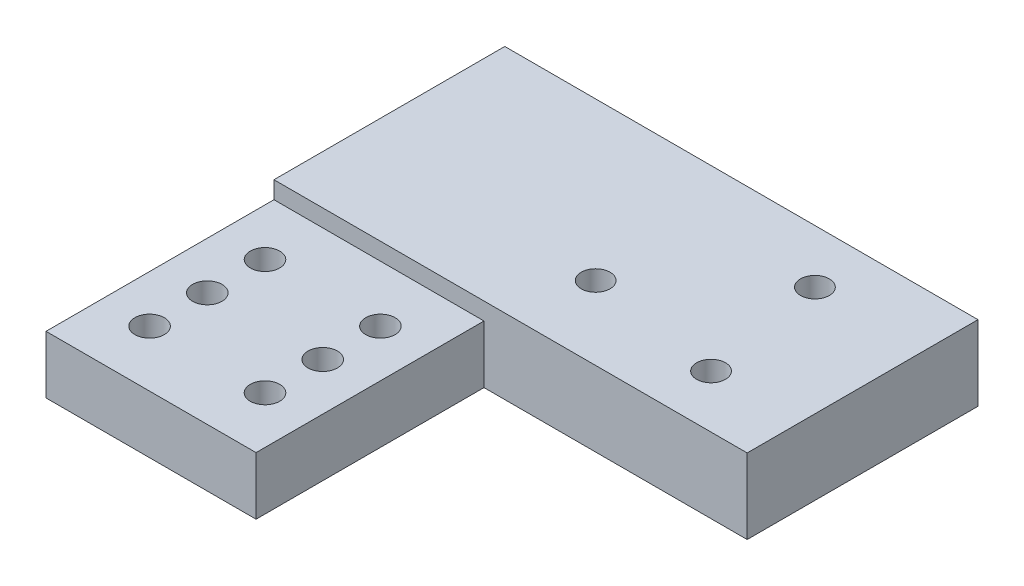
ISO-10303-21;
HEADER;
FILE_DESCRIPTION(('STEP AP214'),'2;1');
FILE_NAME('part.step','',(''),(''),'','','');
FILE_SCHEMA(('AUTOMOTIVE_DESIGN { 1 0 10303 214 1 1 1 1 }'));
ENDSEC;
DATA;
#1=APPLICATION_CONTEXT('core data for automotive mechanical design processes');
#2=APPLICATION_PROTOCOL_DEFINITION('international standard','automotive_design',2000,#1);
#3=PRODUCT_CONTEXT('',#1,'mechanical');
#4=PRODUCT('Part','Part','',(#3));
#5=PRODUCT_RELATED_PRODUCT_CATEGORY('part','',(#4));
#6=PRODUCT_DEFINITION_FORMATION('','',#4);
#7=PRODUCT_DEFINITION_CONTEXT('part definition',#1,'design');
#8=PRODUCT_DEFINITION('design','',#6,#7);
#9=PRODUCT_DEFINITION_SHAPE('','',#8);
#10=(LENGTH_UNIT() NAMED_UNIT(*) SI_UNIT(.MILLI.,.METRE.));
#11=(NAMED_UNIT(*) PLANE_ANGLE_UNIT() SI_UNIT($,.RADIAN.));
#12=(NAMED_UNIT(*) SI_UNIT($,.STERADIAN.) SOLID_ANGLE_UNIT());
#13=UNCERTAINTY_MEASURE_WITH_UNIT(LENGTH_MEASURE(1.E-05),#10,'distance_accuracy_value','');
#14=(GEOMETRIC_REPRESENTATION_CONTEXT(3) GLOBAL_UNCERTAINTY_ASSIGNED_CONTEXT((#13)) GLOBAL_UNIT_ASSIGNED_CONTEXT((#10,
#11,#12)) REPRESENTATION_CONTEXT('',''));
#15=CARTESIAN_POINT('',(0.,0.,0.));
#16=DIRECTION('',(0.,0.,1.));
#17=DIRECTION('',(1.,0.,0.));
#18=AXIS2_PLACEMENT_3D('',#15,#16,#17);
#19=CARTESIAN_POINT('',(0.,10.,0.));
#20=DIRECTION('',(0.,-1.,0.));
#21=DIRECTION('',(0.,0.,-1.));
#22=AXIS2_PLACEMENT_3D('',#19,#20,#21);
#23=PLANE('',#22);
#24=DIRECTION('',(0.,0.,1.));
#25=VECTOR('',#24,1.);
#26=CARTESIAN_POINT('',(0.,10.,0.));
#27=LINE('',#26,#25);
#28=CARTESIAN_POINT('',(0.,10.,-39.5));
#29=VERTEX_POINT('',#28);
#30=CARTESIAN_POINT('',(0.,10.,0.));
#31=VERTEX_POINT('',#30);
#32=EDGE_CURVE('E89',#29,#31,#27,.T.);
#33=ORIENTED_EDGE('',*,*,#32,.T.);
#34=DIRECTION('',(1.,0.,0.));
#35=VECTOR('',#34,1.);
#36=CARTESIAN_POINT('',(0.,10.,0.));
#37=LINE('',#36,#35);
#38=CARTESIAN_POINT('',(36.4,10.,0.));
#39=VERTEX_POINT('',#38);
#40=EDGE_CURVE('E84',#31,#39,#37,.T.);
#41=ORIENTED_EDGE('',*,*,#40,.T.);
#42=DIRECTION('',(0.,0.,-1.));
#43=VECTOR('',#42,1.);
#44=CARTESIAN_POINT('',(36.4,10.,0.));
#45=LINE('',#44,#43);
#46=CARTESIAN_POINT('',(36.4,10.,-39.5));
#47=VERTEX_POINT('',#46);
#48=EDGE_CURVE('E88',#39,#47,#45,.T.);
#49=ORIENTED_EDGE('',*,*,#48,.T.);
#50=DIRECTION('',(-1.,0.,0.));
#51=VECTOR('',#50,1.);
#52=CARTESIAN_POINT('',(0.,10.,-39.5));
#53=LINE('',#52,#51);
#54=EDGE_CURVE('E55',#47,#29,#53,.T.);
#55=ORIENTED_EDGE('',*,*,#54,.T.);
#56=EDGE_LOOP('',(#33,#41,#49,#55));
#57=FACE_BOUND('',#56,.T.);
#58=CARTESIAN_POINT('',(8.2,10.,-29.75));
#59=DIRECTION('',(0.,1.,0.));
#60=DIRECTION('',(0.,0.,1.));
#61=AXIS2_PLACEMENT_3D('',#58,#59,#60);
#62=CIRCLE('',#61,2.55);
#63=CARTESIAN_POINT('',(8.2,10.,-27.2));
#64=VERTEX_POINT('',#63);
#65=EDGE_CURVE('E103',#64,#64,#62,.T.);
#66=ORIENTED_EDGE('',*,*,#65,.F.);
#67=EDGE_LOOP('',(#66));
#68=FACE_BOUND('',#67,.T.);
#69=CARTESIAN_POINT('',(28.2,10.,-29.75));
#70=DIRECTION('',(0.,1.,0.));
#71=DIRECTION('',(0.,0.,1.));
#72=AXIS2_PLACEMENT_3D('',#69,#70,#71);
#73=CIRCLE('',#72,2.55);
#74=CARTESIAN_POINT('',(28.2,10.,-27.2));
#75=VERTEX_POINT('',#74);
#76=EDGE_CURVE('E178',#75,#75,#73,.T.);
#77=ORIENTED_EDGE('',*,*,#76,.F.);
#78=EDGE_LOOP('',(#77));
#79=FACE_BOUND('',#78,.T.);
#80=CARTESIAN_POINT('',(28.2000000000001,10.,-19.75));
#81=DIRECTION('',(0.,1.,0.));
#82=DIRECTION('',(0.,0.,1.));
#83=AXIS2_PLACEMENT_3D('',#80,#81,#82);
#84=CIRCLE('',#83,2.55);
#85=CARTESIAN_POINT('',(28.2000000000001,10.,-17.2));
#86=VERTEX_POINT('',#85);
#87=EDGE_CURVE('E172',#86,#86,#84,.T.);
#88=ORIENTED_EDGE('',*,*,#87,.F.);
#89=EDGE_LOOP('',(#88));
#90=FACE_BOUND('',#89,.T.);
#91=CARTESIAN_POINT('',(28.2000000000002,10.,-9.75));
#92=DIRECTION('',(0.,1.,0.));
#93=DIRECTION('',(0.,0.,1.));
#94=AXIS2_PLACEMENT_3D('',#91,#92,#93);
#95=CIRCLE('',#94,2.55);
#96=CARTESIAN_POINT('',(28.2000000000002,10.,-7.2));
#97=VERTEX_POINT('',#96);
#98=EDGE_CURVE('E166',#97,#97,#95,.T.);
#99=ORIENTED_EDGE('',*,*,#98,.F.);
#100=EDGE_LOOP('',(#99));
#101=FACE_BOUND('',#100,.T.);
#102=CARTESIAN_POINT('',(8.2000000000001,10.,-19.75));
#103=DIRECTION('',(0.,1.,0.));
#104=DIRECTION('',(0.,0.,1.));
#105=AXIS2_PLACEMENT_3D('',#102,#103,#104);
#106=CIRCLE('',#105,2.55);
#107=CARTESIAN_POINT('',(8.2000000000001,10.,-17.2));
#108=VERTEX_POINT('',#107);
#109=EDGE_CURVE('E160',#108,#108,#106,.T.);
#110=ORIENTED_EDGE('',*,*,#109,.F.);
#111=EDGE_LOOP('',(#110));
#112=FACE_BOUND('',#111,.T.);
#113=CARTESIAN_POINT('',(8.20000000000021,10.,-9.75));
#114=DIRECTION('',(0.,1.,0.));
#115=DIRECTION('',(0.,0.,1.));
#116=AXIS2_PLACEMENT_3D('',#113,#114,#115);
#117=CIRCLE('',#116,2.55);
#118=CARTESIAN_POINT('',(8.20000000000021,10.,-7.2));
#119=VERTEX_POINT('',#118);
#120=EDGE_CURVE('E154',#119,#119,#117,.T.);
#121=ORIENTED_EDGE('',*,*,#120,.F.);
#122=EDGE_LOOP('',(#121));
#123=FACE_BOUND('',#122,.T.);
#124=ADVANCED_FACE('F38',(#57,#68,#79,#90,#101,#112,#123),#23,.F.);
#125=CARTESIAN_POINT('',(0.,0.,0.));
#126=DIRECTION('',(0.,-1.,0.));
#127=DIRECTION('',(0.,0.,-1.));
#128=AXIS2_PLACEMENT_3D('',#125,#126,#127);
#129=PLANE('',#128);
#130=CARTESIAN_POINT('',(42.9961003087144,0.,-52.2456670076269));
#131=DIRECTION('',(0.,1.,0.));
#132=DIRECTION('',(0.,0.,1.));
#133=AXIS2_PLACEMENT_3D('',#130,#131,#132);
#134=CIRCLE('',#133,2.5);
#135=CARTESIAN_POINT('',(42.9961003087144,0.,-49.7456670076269));
#136=VERTEX_POINT('',#135);
#137=EDGE_CURVE('E440',#136,#136,#134,.T.);
#138=ORIENTED_EDGE('',*,*,#137,.T.);
#139=EDGE_LOOP('',(#138));
#140=FACE_BOUND('',#139,.T.);
#141=CARTESIAN_POINT('',(62.9961003087144,0.,-70.2456670076269));
#142=DIRECTION('',(0.,1.,0.));
#143=DIRECTION('',(0.,0.,1.));
#144=AXIS2_PLACEMENT_3D('',#141,#142,#143);
#145=CIRCLE('',#144,2.49999999999999);
#146=CARTESIAN_POINT('',(62.9961003087144,0.,-67.7456670076269));
#147=VERTEX_POINT('',#146);
#148=EDGE_CURVE('E450',#147,#147,#145,.T.);
#149=ORIENTED_EDGE('',*,*,#148,.T.);
#150=EDGE_LOOP('',(#149));
#151=FACE_BOUND('',#150,.T.);
#152=CARTESIAN_POINT('',(66.5818867463413,0.,-48.65988057));
#153=DIRECTION('',(0.,1.,0.));
#154=DIRECTION('',(0.,0.,1.));
#155=AXIS2_PLACEMENT_3D('',#152,#153,#154);
#156=CIRCLE('',#155,2.49999999999999);
#157=CARTESIAN_POINT('',(66.5818867463413,0.,-46.15988057));
#158=VERTEX_POINT('',#157);
#159=EDGE_CURVE('E121',#158,#158,#156,.T.);
#160=ORIENTED_EDGE('',*,*,#159,.T.);
#161=EDGE_LOOP('',(#160));
#162=FACE_BOUND('',#161,.T.);
#163=CARTESIAN_POINT('',(8.2000000000001,0.,-19.75));
#164=DIRECTION('',(0.,1.,0.));
#165=DIRECTION('',(0.,0.,1.));
#166=AXIS2_PLACEMENT_3D('',#163,#164,#165);
#167=CIRCLE('',#166,2.55);
#168=CARTESIAN_POINT('',(8.2000000000001,0.,-17.2));
#169=VERTEX_POINT('',#168);
#170=EDGE_CURVE('E157',#169,#169,#167,.T.);
#171=ORIENTED_EDGE('',*,*,#170,.T.);
#172=EDGE_LOOP('',(#171));
#173=FACE_BOUND('',#172,.T.);
#174=CARTESIAN_POINT('',(28.2000000000001,0.,-19.75));
#175=DIRECTION('',(0.,1.,0.));
#176=DIRECTION('',(0.,0.,1.));
#177=AXIS2_PLACEMENT_3D('',#174,#175,#176);
#178=CIRCLE('',#177,2.55);
#179=CARTESIAN_POINT('',(28.2000000000001,0.,-17.2));
#180=VERTEX_POINT('',#179);
#181=EDGE_CURVE('E169',#180,#180,#178,.T.);
#182=ORIENTED_EDGE('',*,*,#181,.T.);
#183=EDGE_LOOP('',(#182));
#184=FACE_BOUND('',#183,.T.);
#185=CARTESIAN_POINT('',(8.2,0.,-29.75));
#186=DIRECTION('',(0.,1.,0.));
#187=DIRECTION('',(0.,0.,1.));
#188=AXIS2_PLACEMENT_3D('',#185,#186,#187);
#189=CIRCLE('',#188,2.55);
#190=CARTESIAN_POINT('',(8.2,0.,-27.2));
#191=VERTEX_POINT('',#190);
#192=EDGE_CURVE('E181',#191,#191,#189,.T.);
#193=ORIENTED_EDGE('',*,*,#192,.T.);
#194=EDGE_LOOP('',(#193));
#195=FACE_BOUND('',#194,.T.);
#196=DIRECTION('',(0.,0.,1.));
#197=VECTOR('',#196,1.);
#198=CARTESIAN_POINT('',(0.,0.,0.));
#199=LINE('',#198,#197);
#200=CARTESIAN_POINT('',(0.,0.,-79.5));
#201=VERTEX_POINT('',#200);
#202=CARTESIAN_POINT('',(0.,0.,0.));
#203=VERTEX_POINT('',#202);
#204=EDGE_CURVE('E100',#201,#203,#199,.T.);
#205=ORIENTED_EDGE('',*,*,#204,.F.);
#206=DIRECTION('',(-1.,0.,0.));
#207=VECTOR('',#206,1.);
#208=CARTESIAN_POINT('',(0.,0.,-79.5));
#209=LINE('',#208,#207);
#210=CARTESIAN_POINT('',(82.,0.,-79.5));
#211=VERTEX_POINT('',#210);
#212=EDGE_CURVE('E123',#211,#201,#209,.T.);
#213=ORIENTED_EDGE('',*,*,#212,.F.);
#214=DIRECTION('',(0.,0.,-1.));
#215=VECTOR('',#214,1.);
#216=CARTESIAN_POINT('',(82.,0.,-39.5));
#217=LINE('',#216,#215);
#218=CARTESIAN_POINT('',(82.,0.,-39.5));
#219=VERTEX_POINT('',#218);
#220=EDGE_CURVE('E120',#219,#211,#217,.T.);
#221=ORIENTED_EDGE('',*,*,#220,.F.);
#222=DIRECTION('',(1.,0.,0.));
#223=VECTOR('',#222,1.);
#224=CARTESIAN_POINT('',(0.,0.,-39.5));
#225=LINE('',#224,#223);
#226=CARTESIAN_POINT('',(36.4,0.,-39.5));
#227=VERTEX_POINT('',#226);
#228=EDGE_CURVE('E112',#227,#219,#225,.T.);
#229=ORIENTED_EDGE('',*,*,#228,.F.);
#230=DIRECTION('',(0.,0.,-1.));
#231=VECTOR('',#230,1.);
#232=CARTESIAN_POINT('',(36.4,0.,0.));
#233=LINE('',#232,#231);
#234=CARTESIAN_POINT('',(36.4,0.,0.));
#235=VERTEX_POINT('',#234);
#236=EDGE_CURVE('E75',#235,#227,#233,.T.);
#237=ORIENTED_EDGE('',*,*,#236,.F.);
#238=DIRECTION('',(1.,0.,0.));
#239=VECTOR('',#238,1.);
#240=CARTESIAN_POINT('',(0.,0.,0.));
#241=LINE('',#240,#239);
#242=EDGE_CURVE('E67',#203,#235,#241,.T.);
#243=ORIENTED_EDGE('',*,*,#242,.F.);
#244=EDGE_LOOP('',(#205,#213,#221,#229,#237,#243));
#245=FACE_BOUND('',#244,.T.);
#246=CARTESIAN_POINT('',(28.2,0.,-29.75));
#247=DIRECTION('',(0.,1.,0.));
#248=DIRECTION('',(0.,0.,1.));
#249=AXIS2_PLACEMENT_3D('',#246,#247,#248);
#250=CIRCLE('',#249,2.55);
#251=CARTESIAN_POINT('',(28.2,0.,-27.2));
#252=VERTEX_POINT('',#251);
#253=EDGE_CURVE('E175',#252,#252,#250,.T.);
#254=ORIENTED_EDGE('',*,*,#253,.T.);
#255=EDGE_LOOP('',(#254));
#256=FACE_BOUND('',#255,.T.);
#257=CARTESIAN_POINT('',(28.2000000000002,0.,-9.75));
#258=DIRECTION('',(0.,1.,0.));
#259=DIRECTION('',(0.,0.,1.));
#260=AXIS2_PLACEMENT_3D('',#257,#258,#259);
#261=CIRCLE('',#260,2.55);
#262=CARTESIAN_POINT('',(28.2000000000002,0.,-7.2));
#263=VERTEX_POINT('',#262);
#264=EDGE_CURVE('E163',#263,#263,#261,.T.);
#265=ORIENTED_EDGE('',*,*,#264,.T.);
#266=EDGE_LOOP('',(#265));
#267=FACE_BOUND('',#266,.T.);
#268=CARTESIAN_POINT('',(8.20000000000021,0.,-9.75));
#269=DIRECTION('',(0.,1.,0.));
#270=DIRECTION('',(0.,0.,1.));
#271=AXIS2_PLACEMENT_3D('',#268,#269,#270);
#272=CIRCLE('',#271,2.55);
#273=CARTESIAN_POINT('',(8.20000000000021,0.,-7.2));
#274=VERTEX_POINT('',#273);
#275=EDGE_CURVE('E153',#274,#274,#272,.T.);
#276=ORIENTED_EDGE('',*,*,#275,.T.);
#277=EDGE_LOOP('',(#276));
#278=FACE_BOUND('',#277,.T.);
#279=ADVANCED_FACE('F116',(#140,#151,#162,#173,#184,#195,#245,#256,#267,#278),#129,.T.);
#280=CARTESIAN_POINT('',(0.,10.,0.));
#281=DIRECTION('',(1.,0.,0.));
#282=DIRECTION('',(0.,0.,-1.));
#283=AXIS2_PLACEMENT_3D('',#280,#281,#282);
#284=PLANE('',#283);
#285=ORIENTED_EDGE('',*,*,#204,.T.);
#286=DIRECTION('',(0.,-1.,0.));
#287=VECTOR('',#286,1.);
#288=CARTESIAN_POINT('',(0.,10.,0.));
#289=LINE('',#288,#287);
#290=EDGE_CURVE('E11',#31,#203,#289,.T.);
#291=ORIENTED_EDGE('',*,*,#290,.F.);
#292=ORIENTED_EDGE('',*,*,#32,.F.);
#293=DIRECTION('',(0.,-1.,0.));
#294=VECTOR('',#293,1.);
#295=CARTESIAN_POINT('',(0.,13.,-39.5));
#296=LINE('',#295,#294);
#297=CARTESIAN_POINT('',(0.,13.,-39.5));
#298=VERTEX_POINT('',#297);
#299=EDGE_CURVE('E151',#298,#29,#296,.T.);
#300=ORIENTED_EDGE('',*,*,#299,.F.);
#301=DIRECTION('',(0.,0.,1.));
#302=VECTOR('',#301,1.);
#303=CARTESIAN_POINT('',(0.,13.,-39.5));
#304=LINE('',#303,#302);
#305=CARTESIAN_POINT('',(0.,13.,-79.5));
#306=VERTEX_POINT('',#305);
#307=EDGE_CURVE('E132',#306,#298,#304,.T.);
#308=ORIENTED_EDGE('',*,*,#307,.F.);
#309=DIRECTION('',(0.,-1.,0.));
#310=VECTOR('',#309,1.);
#311=CARTESIAN_POINT('',(0.,13.,-79.5));
#312=LINE('',#311,#310);
#313=EDGE_CURVE('E143',#306,#201,#312,.T.);
#314=ORIENTED_EDGE('',*,*,#313,.T.);
#315=EDGE_LOOP('',(#285,#291,#292,#300,#308,#314));
#316=FACE_BOUND('',#315,.T.);
#317=ADVANCED_FACE('F40',(#316),#284,.F.);
#318=CARTESIAN_POINT('',(0.,10.,0.));
#319=DIRECTION('',(0.,0.,-1.));
#320=DIRECTION('',(-1.,0.,0.));
#321=AXIS2_PLACEMENT_3D('',#318,#319,#320);
#322=PLANE('',#321);
#323=ORIENTED_EDGE('',*,*,#242,.T.);
#324=DIRECTION('',(0.,-1.,0.));
#325=VECTOR('',#324,1.);
#326=CARTESIAN_POINT('',(36.4,10.,0.));
#327=LINE('',#326,#325);
#328=EDGE_CURVE('E47',#39,#235,#327,.T.);
#329=ORIENTED_EDGE('',*,*,#328,.F.);
#330=ORIENTED_EDGE('',*,*,#40,.F.);
#331=ORIENTED_EDGE('',*,*,#290,.T.);
#332=EDGE_LOOP('',(#323,#329,#330,#331));
#333=FACE_BOUND('',#332,.T.);
#334=ADVANCED_FACE('F93',(#333),#322,.F.);
#335=CARTESIAN_POINT('',(36.4,10.,0.));
#336=DIRECTION('',(-1.,0.,0.));
#337=DIRECTION('',(0.,0.,1.));
#338=AXIS2_PLACEMENT_3D('',#335,#336,#337);
#339=PLANE('',#338);
#340=ORIENTED_EDGE('',*,*,#236,.T.);
#341=DIRECTION('',(0.,-1.,0.));
#342=VECTOR('',#341,1.);
#343=CARTESIAN_POINT('',(36.4,10.,-39.5));
#344=LINE('',#343,#342);
#345=EDGE_CURVE('E94',#47,#227,#344,.T.);
#346=ORIENTED_EDGE('',*,*,#345,.F.);
#347=ORIENTED_EDGE('',*,*,#48,.F.);
#348=ORIENTED_EDGE('',*,*,#328,.T.);
#349=EDGE_LOOP('',(#340,#346,#347,#348));
#350=FACE_BOUND('',#349,.T.);
#351=ADVANCED_FACE('F95',(#350),#339,.F.);
#352=CARTESIAN_POINT('',(8.2,10.,-29.75));
#353=DIRECTION('',(0.,-1.,0.));
#354=DIRECTION('',(0.,0.,-1.));
#355=AXIS2_PLACEMENT_3D('',#352,#353,#354);
#356=CYLINDRICAL_SURFACE('',#355,2.55);
#357=ORIENTED_EDGE('',*,*,#65,.T.);
#358=EDGE_LOOP('',(#357));
#359=FACE_BOUND('',#358,.T.);
#360=ORIENTED_EDGE('',*,*,#192,.F.);
#361=EDGE_LOOP('',(#360));
#362=FACE_BOUND('',#361,.T.);
#363=ADVANCED_FACE('F190',(#359,#362),#356,.F.);
#364=CARTESIAN_POINT('',(28.2,10.,-29.75));
#365=DIRECTION('',(0.,-1.,0.));
#366=DIRECTION('',(0.,0.,-1.));
#367=AXIS2_PLACEMENT_3D('',#364,#365,#366);
#368=CYLINDRICAL_SURFACE('',#367,2.55);
#369=ORIENTED_EDGE('',*,*,#76,.T.);
#370=EDGE_LOOP('',(#369));
#371=FACE_BOUND('',#370,.T.);
#372=ORIENTED_EDGE('',*,*,#253,.F.);
#373=EDGE_LOOP('',(#372));
#374=FACE_BOUND('',#373,.T.);
#375=ADVANCED_FACE('F192',(#371,#374),#368,.F.);
#376=CARTESIAN_POINT('',(28.2000000000001,10.,-19.75));
#377=DIRECTION('',(0.,-1.,0.));
#378=DIRECTION('',(0.,0.,-1.));
#379=AXIS2_PLACEMENT_3D('',#376,#377,#378);
#380=CYLINDRICAL_SURFACE('',#379,2.55);
#381=ORIENTED_EDGE('',*,*,#87,.T.);
#382=EDGE_LOOP('',(#381));
#383=FACE_BOUND('',#382,.T.);
#384=ORIENTED_EDGE('',*,*,#181,.F.);
#385=EDGE_LOOP('',(#384));
#386=FACE_BOUND('',#385,.T.);
#387=ADVANCED_FACE('F199',(#383,#386),#380,.F.);
#388=CARTESIAN_POINT('',(28.2000000000002,10.,-9.75));
#389=DIRECTION('',(0.,-1.,0.));
#390=DIRECTION('',(0.,0.,-1.));
#391=AXIS2_PLACEMENT_3D('',#388,#389,#390);
#392=CYLINDRICAL_SURFACE('',#391,2.55);
#393=ORIENTED_EDGE('',*,*,#98,.T.);
#394=EDGE_LOOP('',(#393));
#395=FACE_BOUND('',#394,.T.);
#396=ORIENTED_EDGE('',*,*,#264,.F.);
#397=EDGE_LOOP('',(#396));
#398=FACE_BOUND('',#397,.T.);
#399=ADVANCED_FACE('F260',(#395,#398),#392,.F.);
#400=CARTESIAN_POINT('',(8.2000000000001,10.,-19.75));
#401=DIRECTION('',(0.,-1.,0.));
#402=DIRECTION('',(0.,0.,-1.));
#403=AXIS2_PLACEMENT_3D('',#400,#401,#402);
#404=CYLINDRICAL_SURFACE('',#403,2.55);
#405=ORIENTED_EDGE('',*,*,#109,.T.);
#406=EDGE_LOOP('',(#405));
#407=FACE_BOUND('',#406,.T.);
#408=ORIENTED_EDGE('',*,*,#170,.F.);
#409=EDGE_LOOP('',(#408));
#410=FACE_BOUND('',#409,.T.);
#411=ADVANCED_FACE('F256',(#407,#410),#404,.F.);
#412=CARTESIAN_POINT('',(8.20000000000021,10.,-9.75));
#413=DIRECTION('',(0.,-1.,0.));
#414=DIRECTION('',(0.,0.,-1.));
#415=AXIS2_PLACEMENT_3D('',#412,#413,#414);
#416=CYLINDRICAL_SURFACE('',#415,2.55);
#417=ORIENTED_EDGE('',*,*,#120,.T.);
#418=EDGE_LOOP('',(#417));
#419=FACE_BOUND('',#418,.T.);
#420=ORIENTED_EDGE('',*,*,#275,.F.);
#421=EDGE_LOOP('',(#420));
#422=FACE_BOUND('',#421,.T.);
#423=ADVANCED_FACE('F253',(#419,#422),#416,.F.);
#424=CARTESIAN_POINT('',(0.,13.,-39.5));
#425=DIRECTION('',(0.,0.,-1.));
#426=DIRECTION('',(-1.,0.,0.));
#427=AXIS2_PLACEMENT_3D('',#424,#425,#426);
#428=PLANE('',#427);
#429=ORIENTED_EDGE('',*,*,#54,.F.);
#430=ORIENTED_EDGE('',*,*,#345,.T.);
#431=ORIENTED_EDGE('',*,*,#228,.T.);
#432=DIRECTION('',(0.,-1.,0.));
#433=VECTOR('',#432,1.);
#434=CARTESIAN_POINT('',(82.,13.,-39.5));
#435=LINE('',#434,#433);
#436=CARTESIAN_POINT('',(82.,13.,-39.5));
#437=VERTEX_POINT('',#436);
#438=EDGE_CURVE('E149',#437,#219,#435,.T.);
#439=ORIENTED_EDGE('',*,*,#438,.F.);
#440=DIRECTION('',(1.,0.,0.));
#441=VECTOR('',#440,1.);
#442=CARTESIAN_POINT('',(0.,13.,-39.5));
#443=LINE('',#442,#441);
#444=EDGE_CURVE('E135',#298,#437,#443,.T.);
#445=ORIENTED_EDGE('',*,*,#444,.F.);
#446=ORIENTED_EDGE('',*,*,#299,.T.);
#447=EDGE_LOOP('',(#429,#430,#431,#439,#445,#446));
#448=FACE_BOUND('',#447,.T.);
#449=ADVANCED_FACE('F109',(#448),#428,.F.);
#450=CARTESIAN_POINT('',(82.,13.,-39.5));
#451=DIRECTION('',(-1.,0.,0.));
#452=DIRECTION('',(0.,0.,1.));
#453=AXIS2_PLACEMENT_3D('',#450,#451,#452);
#454=PLANE('',#453);
#455=ORIENTED_EDGE('',*,*,#438,.T.);
#456=ORIENTED_EDGE('',*,*,#220,.T.);
#457=DIRECTION('',(0.,-1.,0.));
#458=VECTOR('',#457,1.);
#459=CARTESIAN_POINT('',(82.,13.,-79.5));
#460=LINE('',#459,#458);
#461=CARTESIAN_POINT('',(82.,13.,-79.5));
#462=VERTEX_POINT('',#461);
#463=EDGE_CURVE('E146',#462,#211,#460,.T.);
#464=ORIENTED_EDGE('',*,*,#463,.F.);
#465=DIRECTION('',(0.,0.,-1.));
#466=VECTOR('',#465,1.);
#467=CARTESIAN_POINT('',(82.,13.,-39.5));
#468=LINE('',#467,#466);
#469=EDGE_CURVE('E138',#437,#462,#468,.T.);
#470=ORIENTED_EDGE('',*,*,#469,.F.);
#471=EDGE_LOOP('',(#455,#456,#464,#470));
#472=FACE_BOUND('',#471,.T.);
#473=ADVANCED_FACE('F235',(#472),#454,.F.);
#474=CARTESIAN_POINT('',(0.,13.,-79.5));
#475=DIRECTION('',(0.,0.,1.));
#476=DIRECTION('',(1.,0.,0.));
#477=AXIS2_PLACEMENT_3D('',#474,#475,#476);
#478=PLANE('',#477);
#479=ORIENTED_EDGE('',*,*,#463,.T.);
#480=ORIENTED_EDGE('',*,*,#212,.T.);
#481=ORIENTED_EDGE('',*,*,#313,.F.);
#482=DIRECTION('',(-1.,0.,0.));
#483=VECTOR('',#482,1.);
#484=CARTESIAN_POINT('',(0.,13.,-79.5));
#485=LINE('',#484,#483);
#486=EDGE_CURVE('E141',#462,#306,#485,.T.);
#487=ORIENTED_EDGE('',*,*,#486,.F.);
#488=EDGE_LOOP('',(#479,#480,#481,#487));
#489=FACE_BOUND('',#488,.T.);
#490=ADVANCED_FACE('F237',(#489),#478,.F.);
#491=CARTESIAN_POINT('',(0.,13.,0.));
#492=DIRECTION('',(0.,-1.,0.));
#493=DIRECTION('',(0.,0.,-1.));
#494=AXIS2_PLACEMENT_3D('',#491,#492,#493);
#495=PLANE('',#494);
#496=CARTESIAN_POINT('',(42.9961003087144,13.,-52.2456670076269));
#497=DIRECTION('',(0.,1.,0.));
#498=DIRECTION('',(0.,0.,1.));
#499=AXIS2_PLACEMENT_3D('',#496,#497,#498);
#500=CIRCLE('',#499,2.49999999999999);
#501=CARTESIAN_POINT('',(42.9961003087144,13.,-49.7456670076269));
#502=VERTEX_POINT('',#501);
#503=EDGE_CURVE('E443',#502,#502,#500,.T.);
#504=ORIENTED_EDGE('',*,*,#503,.F.);
#505=EDGE_LOOP('',(#504));
#506=FACE_BOUND('',#505,.T.);
#507=CARTESIAN_POINT('',(62.9961003087144,13.,-70.2456670076269));
#508=DIRECTION('',(0.,1.,0.));
#509=DIRECTION('',(0.,0.,1.));
#510=AXIS2_PLACEMENT_3D('',#507,#508,#509);
#511=CIRCLE('',#510,2.49999999999999);
#512=CARTESIAN_POINT('',(62.9961003087144,13.,-67.7456670076269));
#513=VERTEX_POINT('',#512);
#514=EDGE_CURVE('E445',#513,#513,#511,.T.);
#515=ORIENTED_EDGE('',*,*,#514,.F.);
#516=EDGE_LOOP('',(#515));
#517=FACE_BOUND('',#516,.T.);
#518=CARTESIAN_POINT('',(66.5818867463413,13.,-48.65988057));
#519=DIRECTION('',(0.,1.,0.));
#520=DIRECTION('',(0.,0.,1.));
#521=AXIS2_PLACEMENT_3D('',#518,#519,#520);
#522=CIRCLE('',#521,2.49999999999999);
#523=CARTESIAN_POINT('',(66.5818867463413,13.,-46.15988057));
#524=VERTEX_POINT('',#523);
#525=EDGE_CURVE('E126',#524,#524,#522,.T.);
#526=ORIENTED_EDGE('',*,*,#525,.F.);
#527=EDGE_LOOP('',(#526));
#528=FACE_BOUND('',#527,.T.);
#529=ORIENTED_EDGE('',*,*,#307,.T.);
#530=ORIENTED_EDGE('',*,*,#444,.T.);
#531=ORIENTED_EDGE('',*,*,#469,.T.);
#532=ORIENTED_EDGE('',*,*,#486,.T.);
#533=EDGE_LOOP('',(#529,#530,#531,#532));
#534=FACE_BOUND('',#533,.T.);
#535=ADVANCED_FACE('F232',(#506,#517,#528,#534),#495,.F.);
#536=CARTESIAN_POINT('',(66.5818867463413,13.,-48.65988057));
#537=DIRECTION('',(0.,1.,0.));
#538=DIRECTION('',(0.,0.,1.));
#539=AXIS2_PLACEMENT_3D('',#536,#537,#538);
#540=CYLINDRICAL_SURFACE('',#539,2.49999999999999);
#541=ORIENTED_EDGE('',*,*,#159,.F.);
#542=EDGE_LOOP('',(#541));
#543=FACE_BOUND('',#542,.T.);
#544=ORIENTED_EDGE('',*,*,#525,.T.);
#545=EDGE_LOOP('',(#544));
#546=FACE_BOUND('',#545,.T.);
#547=ADVANCED_FACE('F245',(#543,#546),#540,.F.);
#548=CARTESIAN_POINT('',(62.9961003087144,13.,-70.2456670076269));
#549=DIRECTION('',(0.,1.,0.));
#550=DIRECTION('',(0.,0.,1.));
#551=AXIS2_PLACEMENT_3D('',#548,#549,#550);
#552=CYLINDRICAL_SURFACE('',#551,2.49999999999999);
#553=ORIENTED_EDGE('',*,*,#148,.F.);
#554=EDGE_LOOP('',(#553));
#555=FACE_BOUND('',#554,.T.);
#556=ORIENTED_EDGE('',*,*,#514,.T.);
#557=EDGE_LOOP('',(#556));
#558=FACE_BOUND('',#557,.T.);
#559=ADVANCED_FACE('F342',(#555,#558),#552,.F.);
#560=CARTESIAN_POINT('',(42.9961003087144,13.,-52.2456670076269));
#561=DIRECTION('',(0.,1.,0.));
#562=DIRECTION('',(0.,0.,1.));
#563=AXIS2_PLACEMENT_3D('',#560,#561,#562);
#564=CYLINDRICAL_SURFACE('',#563,2.49999999999999);
#565=ORIENTED_EDGE('',*,*,#137,.F.);
#566=EDGE_LOOP('',(#565));
#567=FACE_BOUND('',#566,.T.);
#568=ORIENTED_EDGE('',*,*,#503,.T.);
#569=EDGE_LOOP('',(#568));
#570=FACE_BOUND('',#569,.T.);
#571=ADVANCED_FACE('F352',(#567,#570),#564,.F.);
#572=CLOSED_SHELL('',(#124,#279,#317,#334,#351,#363,#375,#387,#399,#411,#423,#449,#473,#490,
#535,#547,#559,#571));
#573=MANIFOLD_SOLID_BREP('B2',#572);
#574=ADVANCED_BREP_SHAPE_REPRESENTATION('',(#18,#573),#14);
#575=SHAPE_DEFINITION_REPRESENTATION(#9,#574);
ENDSEC;
END-ISO-10303-21;
